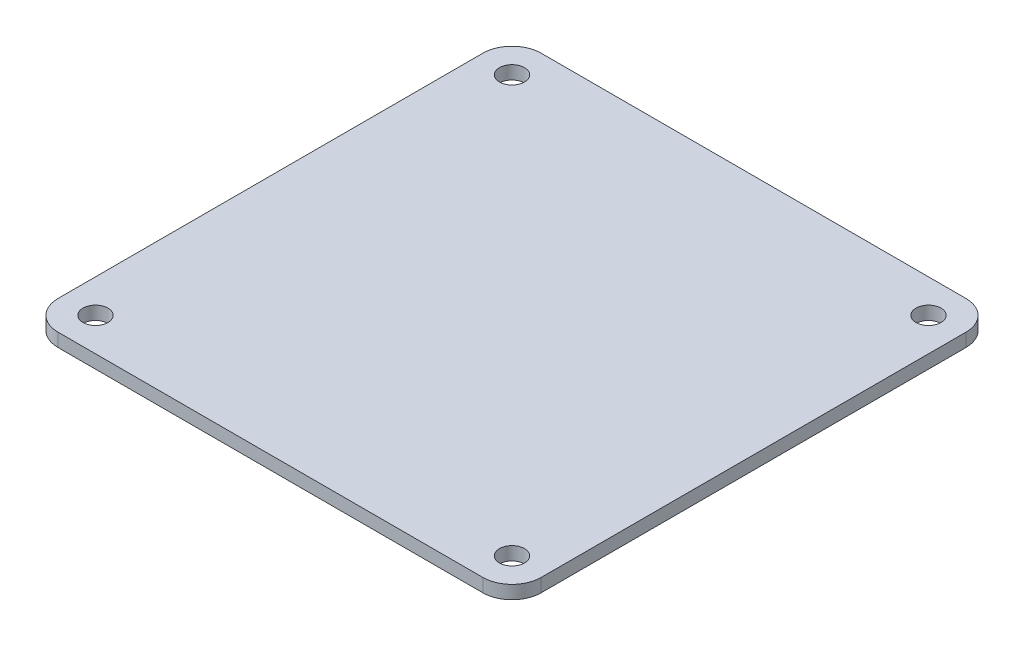
ISO-10303-21;
HEADER;
FILE_DESCRIPTION(('STEP AP214'),'2;1');
FILE_NAME('part.step','',(''),(''),'','','');
FILE_SCHEMA(('AUTOMOTIVE_DESIGN { 1 0 10303 214 1 1 1 1 }'));
ENDSEC;
DATA;
#1=APPLICATION_CONTEXT('core data for automotive mechanical design processes');
#2=APPLICATION_PROTOCOL_DEFINITION('international standard','automotive_design',2000,#1);
#3=PRODUCT_CONTEXT('',#1,'mechanical');
#4=PRODUCT('Part','Part','',(#3));
#5=PRODUCT_RELATED_PRODUCT_CATEGORY('part','',(#4));
#6=PRODUCT_DEFINITION_FORMATION('','',#4);
#7=PRODUCT_DEFINITION_CONTEXT('part definition',#1,'design');
#8=PRODUCT_DEFINITION('design','',#6,#7);
#9=PRODUCT_DEFINITION_SHAPE('','',#8);
#10=(LENGTH_UNIT() NAMED_UNIT(*) SI_UNIT(.MILLI.,.METRE.));
#11=(NAMED_UNIT(*) PLANE_ANGLE_UNIT() SI_UNIT($,.RADIAN.));
#12=(NAMED_UNIT(*) SI_UNIT($,.STERADIAN.) SOLID_ANGLE_UNIT());
#13=UNCERTAINTY_MEASURE_WITH_UNIT(LENGTH_MEASURE(1.E-05),#10,'distance_accuracy_value','');
#14=(GEOMETRIC_REPRESENTATION_CONTEXT(3) GLOBAL_UNCERTAINTY_ASSIGNED_CONTEXT((#13)) GLOBAL_UNIT_ASSIGNED_CONTEXT((#10,
#11,#12)) REPRESENTATION_CONTEXT('',''));
#15=CARTESIAN_POINT('',(0.,0.,0.));
#16=DIRECTION('',(0.,0.,1.));
#17=DIRECTION('',(1.,0.,0.));
#18=AXIS2_PLACEMENT_3D('',#15,#16,#17);
#19=CARTESIAN_POINT('',(0.,1.6,0.));
#20=DIRECTION('',(0.,1.,0.));
#21=DIRECTION('',(0.,0.,1.));
#22=AXIS2_PLACEMENT_3D('',#19,#20,#21);
#23=PLANE('',#22);
#24=CARTESIAN_POINT('',(25.,1.6,25.));
#25=DIRECTION('',(0.,1.,0.));
#26=DIRECTION('',(0.,0.,1.));
#27=AXIS2_PLACEMENT_3D('',#24,#25,#26);
#28=CIRCLE('',#27,1.5);
#29=CARTESIAN_POINT('',(25.,1.6,26.5));
#30=VERTEX_POINT('',#29);
#31=EDGE_CURVE('E186',#30,#30,#28,.T.);
#32=ORIENTED_EDGE('',*,*,#31,.F.);
#33=EDGE_LOOP('',(#32));
#34=FACE_BOUND('',#33,.T.);
#35=CARTESIAN_POINT('',(-25.,1.6,-25.));
#36=DIRECTION('',(0.,1.,0.));
#37=DIRECTION('',(0.,0.,1.));
#38=AXIS2_PLACEMENT_3D('',#35,#36,#37);
#39=CIRCLE('',#38,1.5);
#40=CARTESIAN_POINT('',(-25.,1.6,-23.5));
#41=VERTEX_POINT('',#40);
#42=EDGE_CURVE('E128',#41,#41,#39,.T.);
#43=ORIENTED_EDGE('',*,*,#42,.F.);
#44=EDGE_LOOP('',(#43));
#45=FACE_BOUND('',#44,.T.);
#46=DIRECTION('',(-1.,0.,0.));
#47=VECTOR('',#46,1.);
#48=CARTESIAN_POINT('',(-29.,1.6,-29.));
#49=LINE('',#48,#47);
#50=CARTESIAN_POINT('',(25.5,1.6,-29.));
#51=VERTEX_POINT('',#50);
#52=CARTESIAN_POINT('',(-25.5,1.6,-29.));
#53=VERTEX_POINT('',#52);
#54=EDGE_CURVE('E137',#51,#53,#49,.T.);
#55=ORIENTED_EDGE('',*,*,#54,.T.);
#56=CARTESIAN_POINT('',(-25.5,1.6,-25.5));
#57=DIRECTION('',(0.,1.,0.));
#58=DIRECTION('',(0.,0.,1.));
#59=AXIS2_PLACEMENT_3D('',#56,#57,#58);
#60=CIRCLE('',#59,3.5);
#61=CARTESIAN_POINT('',(-29.,1.6,-25.5));
#62=VERTEX_POINT('',#61);
#63=EDGE_CURVE('E156',#53,#62,#60,.T.);
#64=ORIENTED_EDGE('',*,*,#63,.T.);
#65=DIRECTION('',(0.,0.,1.));
#66=VECTOR('',#65,1.);
#67=CARTESIAN_POINT('',(-29.,1.6,-29.));
#68=LINE('',#67,#66);
#69=CARTESIAN_POINT('',(-29.,1.6,25.5));
#70=VERTEX_POINT('',#69);
#71=EDGE_CURVE('E120',#62,#70,#68,.T.);
#72=ORIENTED_EDGE('',*,*,#71,.T.);
#73=CARTESIAN_POINT('',(-25.5,1.6,25.5));
#74=DIRECTION('',(0.,1.,0.));
#75=DIRECTION('',(0.,0.,1.));
#76=AXIS2_PLACEMENT_3D('',#73,#74,#75);
#77=CIRCLE('',#76,3.5);
#78=CARTESIAN_POINT('',(-25.5,1.6,29.));
#79=VERTEX_POINT('',#78);
#80=EDGE_CURVE('E154',#70,#79,#77,.T.);
#81=ORIENTED_EDGE('',*,*,#80,.T.);
#82=DIRECTION('',(1.,0.,0.));
#83=VECTOR('',#82,1.);
#84=CARTESIAN_POINT('',(-29.,1.6,29.));
#85=LINE('',#84,#83);
#86=CARTESIAN_POINT('',(25.5,1.6,29.));
#87=VERTEX_POINT('',#86);
#88=EDGE_CURVE('E176',#79,#87,#85,.T.);
#89=ORIENTED_EDGE('',*,*,#88,.T.);
#90=CARTESIAN_POINT('',(25.5,1.6,25.5));
#91=DIRECTION('',(0.,1.,0.));
#92=DIRECTION('',(0.,0.,1.));
#93=AXIS2_PLACEMENT_3D('',#90,#91,#92);
#94=CIRCLE('',#93,3.5);
#95=CARTESIAN_POINT('',(29.,1.6,25.5));
#96=VERTEX_POINT('',#95);
#97=EDGE_CURVE('E55',#87,#96,#94,.T.);
#98=ORIENTED_EDGE('',*,*,#97,.T.);
#99=DIRECTION('',(0.,0.,-1.));
#100=VECTOR('',#99,1.);
#101=CARTESIAN_POINT('',(29.,1.6,-29.));
#102=LINE('',#101,#100);
#103=CARTESIAN_POINT('',(29.,1.6,-25.5));
#104=VERTEX_POINT('',#103);
#105=EDGE_CURVE('E166',#96,#104,#102,.T.);
#106=ORIENTED_EDGE('',*,*,#105,.T.);
#107=CARTESIAN_POINT('',(25.5,1.6,-25.5));
#108=DIRECTION('',(0.,1.,0.));
#109=DIRECTION('',(0.,0.,1.));
#110=AXIS2_PLACEMENT_3D('',#107,#108,#109);
#111=CIRCLE('',#110,3.5);
#112=EDGE_CURVE('E152',#104,#51,#111,.T.);
#113=ORIENTED_EDGE('',*,*,#112,.T.);
#114=EDGE_LOOP('',(#55,#64,#72,#81,#89,#98,#106,#113));
#115=FACE_BOUND('',#114,.T.);
#116=CARTESIAN_POINT('',(25.,1.6,-25.));
#117=DIRECTION('',(0.,1.,0.));
#118=DIRECTION('',(0.,0.,-1.));
#119=AXIS2_PLACEMENT_3D('',#116,#117,#118);
#120=CIRCLE('',#119,1.49999999999999);
#121=CARTESIAN_POINT('',(25.,1.6,-26.5));
#122=VERTEX_POINT('',#121);
#123=EDGE_CURVE('E181',#122,#122,#120,.T.);
#124=ORIENTED_EDGE('',*,*,#123,.F.);
#125=EDGE_LOOP('',(#124));
#126=FACE_BOUND('',#125,.T.);
#127=CARTESIAN_POINT('',(-25.,1.6,25.));
#128=DIRECTION('',(0.,1.,0.));
#129=DIRECTION('',(0.,0.,-1.));
#130=AXIS2_PLACEMENT_3D('',#127,#128,#129);
#131=CIRCLE('',#130,1.49999999999999);
#132=CARTESIAN_POINT('',(-25.,1.6,23.5));
#133=VERTEX_POINT('',#132);
#134=EDGE_CURVE('E192',#133,#133,#131,.T.);
#135=ORIENTED_EDGE('',*,*,#134,.F.);
#136=EDGE_LOOP('',(#135));
#137=FACE_BOUND('',#136,.T.);
#138=ADVANCED_FACE('F35',(#34,#45,#115,#126,#137),#23,.T.);
#139=CARTESIAN_POINT('',(0.,0.,0.));
#140=DIRECTION('',(0.,1.,0.));
#141=DIRECTION('',(0.,0.,1.));
#142=AXIS2_PLACEMENT_3D('',#139,#140,#141);
#143=PLANE('',#142);
#144=DIRECTION('',(0.,0.,1.));
#145=VECTOR('',#144,1.);
#146=CARTESIAN_POINT('',(-29.,0.,-29.));
#147=LINE('',#146,#145);
#148=CARTESIAN_POINT('',(-29.,0.,-25.5));
#149=VERTEX_POINT('',#148);
#150=CARTESIAN_POINT('',(-29.,0.,25.5));
#151=VERTEX_POINT('',#150);
#152=EDGE_CURVE('E117',#149,#151,#147,.T.);
#153=ORIENTED_EDGE('',*,*,#152,.F.);
#154=CARTESIAN_POINT('',(-25.5,0.,-25.5));
#155=DIRECTION('',(0.,1.,0.));
#156=DIRECTION('',(0.,0.,1.));
#157=AXIS2_PLACEMENT_3D('',#154,#155,#156);
#158=CIRCLE('',#157,3.5);
#159=CARTESIAN_POINT('',(-25.5,0.,-29.));
#160=VERTEX_POINT('',#159);
#161=EDGE_CURVE('E100',#149,#160,#158,.F.);
#162=ORIENTED_EDGE('',*,*,#161,.T.);
#163=DIRECTION('',(-1.,0.,0.));
#164=VECTOR('',#163,1.);
#165=CARTESIAN_POINT('',(-29.,0.,-29.));
#166=LINE('',#165,#164);
#167=CARTESIAN_POINT('',(25.5,0.,-29.));
#168=VERTEX_POINT('',#167);
#169=EDGE_CURVE('E141',#168,#160,#166,.T.);
#170=ORIENTED_EDGE('',*,*,#169,.F.);
#171=CARTESIAN_POINT('',(25.5,0.,-25.5));
#172=DIRECTION('',(0.,1.,0.));
#173=DIRECTION('',(0.,0.,1.));
#174=AXIS2_PLACEMENT_3D('',#171,#172,#173);
#175=CIRCLE('',#174,3.5);
#176=CARTESIAN_POINT('',(29.,0.,-25.5));
#177=VERTEX_POINT('',#176);
#178=EDGE_CURVE('E145',#168,#177,#175,.F.);
#179=ORIENTED_EDGE('',*,*,#178,.T.);
#180=DIRECTION('',(0.,0.,-1.));
#181=VECTOR('',#180,1.);
#182=CARTESIAN_POINT('',(29.,0.,-29.));
#183=LINE('',#182,#181);
#184=CARTESIAN_POINT('',(29.,0.,25.5));
#185=VERTEX_POINT('',#184);
#186=EDGE_CURVE('E131',#185,#177,#183,.T.);
#187=ORIENTED_EDGE('',*,*,#186,.F.);
#188=CARTESIAN_POINT('',(25.5,0.,25.5));
#189=DIRECTION('',(0.,1.,0.));
#190=DIRECTION('',(0.,0.,1.));
#191=AXIS2_PLACEMENT_3D('',#188,#189,#190);
#192=CIRCLE('',#191,3.5);
#193=CARTESIAN_POINT('',(25.5,0.,29.));
#194=VERTEX_POINT('',#193);
#195=EDGE_CURVE('E121',#185,#194,#192,.F.);
#196=ORIENTED_EDGE('',*,*,#195,.T.);
#197=DIRECTION('',(1.,0.,0.));
#198=VECTOR('',#197,1.);
#199=CARTESIAN_POINT('',(-29.,0.,29.));
#200=LINE('',#199,#198);
#201=CARTESIAN_POINT('',(-25.5,0.,29.));
#202=VERTEX_POINT('',#201);
#203=EDGE_CURVE('E127',#202,#194,#200,.T.);
#204=ORIENTED_EDGE('',*,*,#203,.F.);
#205=CARTESIAN_POINT('',(-25.5,0.,25.5));
#206=DIRECTION('',(0.,1.,0.));
#207=DIRECTION('',(0.,0.,1.));
#208=AXIS2_PLACEMENT_3D('',#205,#206,#207);
#209=CIRCLE('',#208,3.5);
#210=EDGE_CURVE('E111',#202,#151,#209,.F.);
#211=ORIENTED_EDGE('',*,*,#210,.T.);
#212=EDGE_LOOP('',(#153,#162,#170,#179,#187,#196,#204,#211));
#213=FACE_BOUND('',#212,.T.);
#214=CARTESIAN_POINT('',(-25.,0.,-25.));
#215=DIRECTION('',(0.,1.,0.));
#216=DIRECTION('',(0.,0.,1.));
#217=AXIS2_PLACEMENT_3D('',#214,#215,#216);
#218=CIRCLE('',#217,1.5);
#219=CARTESIAN_POINT('',(-25.,0.,-23.5));
#220=VERTEX_POINT('',#219);
#221=EDGE_CURVE('E134',#220,#220,#218,.T.);
#222=ORIENTED_EDGE('',*,*,#221,.T.);
#223=EDGE_LOOP('',(#222));
#224=FACE_BOUND('',#223,.T.);
#225=CARTESIAN_POINT('',(25.,0.,-25.));
#226=DIRECTION('',(0.,1.,0.));
#227=DIRECTION('',(0.,0.,-1.));
#228=AXIS2_PLACEMENT_3D('',#225,#226,#227);
#229=CIRCLE('',#228,1.49999999999999);
#230=CARTESIAN_POINT('',(25.,0.,-26.5));
#231=VERTEX_POINT('',#230);
#232=EDGE_CURVE('E183',#231,#231,#229,.T.);
#233=ORIENTED_EDGE('',*,*,#232,.T.);
#234=EDGE_LOOP('',(#233));
#235=FACE_BOUND('',#234,.T.);
#236=CARTESIAN_POINT('',(25.,0.,25.));
#237=DIRECTION('',(0.,1.,0.));
#238=DIRECTION('',(0.,0.,1.));
#239=AXIS2_PLACEMENT_3D('',#236,#237,#238);
#240=CIRCLE('',#239,1.5);
#241=CARTESIAN_POINT('',(25.,0.,26.5));
#242=VERTEX_POINT('',#241);
#243=EDGE_CURVE('E189',#242,#242,#240,.T.);
#244=ORIENTED_EDGE('',*,*,#243,.T.);
#245=EDGE_LOOP('',(#244));
#246=FACE_BOUND('',#245,.T.);
#247=CARTESIAN_POINT('',(-25.,0.,25.));
#248=DIRECTION('',(0.,1.,0.));
#249=DIRECTION('',(0.,0.,-1.));
#250=AXIS2_PLACEMENT_3D('',#247,#248,#249);
#251=CIRCLE('',#250,1.49999999999999);
#252=CARTESIAN_POINT('',(-25.,0.,23.5));
#253=VERTEX_POINT('',#252);
#254=EDGE_CURVE('E195',#253,#253,#251,.T.);
#255=ORIENTED_EDGE('',*,*,#254,.T.);
#256=EDGE_LOOP('',(#255));
#257=FACE_BOUND('',#256,.T.);
#258=ADVANCED_FACE('F124',(#213,#224,#235,#246,#257),#143,.F.);
#259=CARTESIAN_POINT('',(-29.,1.6,-29.));
#260=DIRECTION('',(1.,0.,0.));
#261=DIRECTION('',(0.,0.,-1.));
#262=AXIS2_PLACEMENT_3D('',#259,#260,#261);
#263=PLANE('',#262);
#264=ORIENTED_EDGE('',*,*,#71,.F.);
#265=DIRECTION('',(0.,-1.,0.));
#266=VECTOR('',#265,1.);
#267=CARTESIAN_POINT('',(-29.,1.6,-25.5));
#268=LINE('',#267,#266);
#269=EDGE_CURVE('E104',#62,#149,#268,.T.);
#270=ORIENTED_EDGE('',*,*,#269,.T.);
#271=ORIENTED_EDGE('',*,*,#152,.T.);
#272=DIRECTION('',(0.,-1.,0.));
#273=VECTOR('',#272,1.);
#274=CARTESIAN_POINT('',(-29.,1.6,25.5));
#275=LINE('',#274,#273);
#276=EDGE_CURVE('E122',#151,#70,#275,.F.);
#277=ORIENTED_EDGE('',*,*,#276,.T.);
#278=EDGE_LOOP('',(#264,#270,#271,#277));
#279=FACE_BOUND('',#278,.T.);
#280=ADVANCED_FACE('F116',(#279),#263,.F.);
#281=CARTESIAN_POINT('',(-29.,1.6,29.));
#282=DIRECTION('',(0.,0.,-1.));
#283=DIRECTION('',(-1.,0.,0.));
#284=AXIS2_PLACEMENT_3D('',#281,#282,#283);
#285=PLANE('',#284);
#286=ORIENTED_EDGE('',*,*,#88,.F.);
#287=DIRECTION('',(0.,-1.,0.));
#288=VECTOR('',#287,1.);
#289=CARTESIAN_POINT('',(-25.5,1.6,29.));
#290=LINE('',#289,#288);
#291=EDGE_CURVE('E160',#79,#202,#290,.T.);
#292=ORIENTED_EDGE('',*,*,#291,.T.);
#293=ORIENTED_EDGE('',*,*,#203,.T.);
#294=DIRECTION('',(0.,-1.,0.));
#295=VECTOR('',#294,1.);
#296=CARTESIAN_POINT('',(25.5,1.6,29.));
#297=LINE('',#296,#295);
#298=EDGE_CURVE('E158',#194,#87,#297,.F.);
#299=ORIENTED_EDGE('',*,*,#298,.T.);
#300=EDGE_LOOP('',(#286,#292,#293,#299));
#301=FACE_BOUND('',#300,.T.);
#302=ADVANCED_FACE('F221',(#301),#285,.F.);
#303=CARTESIAN_POINT('',(29.,1.6,-29.));
#304=DIRECTION('',(-1.,0.,0.));
#305=DIRECTION('',(0.,0.,1.));
#306=AXIS2_PLACEMENT_3D('',#303,#304,#305);
#307=PLANE('',#306);
#308=ORIENTED_EDGE('',*,*,#186,.T.);
#309=DIRECTION('',(0.,-1.,0.));
#310=VECTOR('',#309,1.);
#311=CARTESIAN_POINT('',(29.,1.6,-25.5));
#312=LINE('',#311,#310);
#313=EDGE_CURVE('E11',#177,#104,#312,.F.);
#314=ORIENTED_EDGE('',*,*,#313,.T.);
#315=ORIENTED_EDGE('',*,*,#105,.F.);
#316=DIRECTION('',(0.,-1.,0.));
#317=VECTOR('',#316,1.);
#318=CARTESIAN_POINT('',(29.,1.6,25.5));
#319=LINE('',#318,#317);
#320=EDGE_CURVE('E43',#96,#185,#319,.T.);
#321=ORIENTED_EDGE('',*,*,#320,.T.);
#322=EDGE_LOOP('',(#308,#314,#315,#321));
#323=FACE_BOUND('',#322,.T.);
#324=ADVANCED_FACE('F165',(#323),#307,.F.);
#325=CARTESIAN_POINT('',(-29.,1.6,-29.));
#326=DIRECTION('',(0.,0.,1.));
#327=DIRECTION('',(1.,0.,0.));
#328=AXIS2_PLACEMENT_3D('',#325,#326,#327);
#329=PLANE('',#328);
#330=ORIENTED_EDGE('',*,*,#169,.T.);
#331=DIRECTION('',(0.,-1.,0.));
#332=VECTOR('',#331,1.);
#333=CARTESIAN_POINT('',(-25.5,1.6,-29.));
#334=LINE('',#333,#332);
#335=EDGE_CURVE('E105',#160,#53,#334,.F.);
#336=ORIENTED_EDGE('',*,*,#335,.T.);
#337=ORIENTED_EDGE('',*,*,#54,.F.);
#338=DIRECTION('',(0.,-1.,0.));
#339=VECTOR('',#338,1.);
#340=CARTESIAN_POINT('',(25.5,1.6,-29.));
#341=LINE('',#340,#339);
#342=EDGE_CURVE('E110',#51,#168,#341,.T.);
#343=ORIENTED_EDGE('',*,*,#342,.T.);
#344=EDGE_LOOP('',(#330,#336,#337,#343));
#345=FACE_BOUND('',#344,.T.);
#346=ADVANCED_FACE('F174',(#345),#329,.F.);
#347=CARTESIAN_POINT('',(-25.,1.6,-25.));
#348=DIRECTION('',(0.,-1.,0.));
#349=DIRECTION('',(0.,0.,-1.));
#350=AXIS2_PLACEMENT_3D('',#347,#348,#349);
#351=CYLINDRICAL_SURFACE('',#350,1.5);
#352=ORIENTED_EDGE('',*,*,#42,.T.);
#353=EDGE_LOOP('',(#352));
#354=FACE_BOUND('',#353,.T.);
#355=ORIENTED_EDGE('',*,*,#221,.F.);
#356=EDGE_LOOP('',(#355));
#357=FACE_BOUND('',#356,.T.);
#358=ADVANCED_FACE('F214',(#354,#357),#351,.F.);
#359=CARTESIAN_POINT('',(25.,1.6,-25.));
#360=DIRECTION('',(0.,-1.,0.));
#361=DIRECTION('',(0.,0.,-1.));
#362=AXIS2_PLACEMENT_3D('',#359,#360,#361);
#363=CYLINDRICAL_SURFACE('',#362,1.49999999999999);
#364=ORIENTED_EDGE('',*,*,#123,.T.);
#365=EDGE_LOOP('',(#364));
#366=FACE_BOUND('',#365,.T.);
#367=ORIENTED_EDGE('',*,*,#232,.F.);
#368=EDGE_LOOP('',(#367));
#369=FACE_BOUND('',#368,.T.);
#370=ADVANCED_FACE('F245',(#366,#369),#363,.F.);
#371=CARTESIAN_POINT('',(25.,1.6,25.));
#372=DIRECTION('',(0.,-1.,0.));
#373=DIRECTION('',(0.,0.,-1.));
#374=AXIS2_PLACEMENT_3D('',#371,#372,#373);
#375=CYLINDRICAL_SURFACE('',#374,1.5);
#376=ORIENTED_EDGE('',*,*,#31,.T.);
#377=EDGE_LOOP('',(#376));
#378=FACE_BOUND('',#377,.T.);
#379=ORIENTED_EDGE('',*,*,#243,.F.);
#380=EDGE_LOOP('',(#379));
#381=FACE_BOUND('',#380,.T.);
#382=ADVANCED_FACE('F248',(#378,#381),#375,.F.);
#383=CARTESIAN_POINT('',(-25.,1.6,25.));
#384=DIRECTION('',(0.,-1.,0.));
#385=DIRECTION('',(0.,0.,-1.));
#386=AXIS2_PLACEMENT_3D('',#383,#384,#385);
#387=CYLINDRICAL_SURFACE('',#386,1.49999999999999);
#388=ORIENTED_EDGE('',*,*,#134,.T.);
#389=EDGE_LOOP('',(#388));
#390=FACE_BOUND('',#389,.T.);
#391=ORIENTED_EDGE('',*,*,#254,.F.);
#392=EDGE_LOOP('',(#391));
#393=FACE_BOUND('',#392,.T.);
#394=ADVANCED_FACE('F201',(#390,#393),#387,.F.);
#395=CARTESIAN_POINT('',(-25.5,1.6,-25.5));
#396=DIRECTION('',(0.,-1.,0.));
#397=DIRECTION('',(0.,0.,-1.));
#398=AXIS2_PLACEMENT_3D('',#395,#396,#397);
#399=CYLINDRICAL_SURFACE('',#398,3.5);
#400=ORIENTED_EDGE('',*,*,#63,.F.);
#401=ORIENTED_EDGE('',*,*,#335,.F.);
#402=ORIENTED_EDGE('',*,*,#161,.F.);
#403=ORIENTED_EDGE('',*,*,#269,.F.);
#404=EDGE_LOOP('',(#400,#401,#402,#403));
#405=FACE_BOUND('',#404,.T.);
#406=ADVANCED_FACE('F103',(#405),#399,.T.);
#407=CARTESIAN_POINT('',(-25.5,1.6,25.5));
#408=DIRECTION('',(0.,-1.,0.));
#409=DIRECTION('',(0.,0.,-1.));
#410=AXIS2_PLACEMENT_3D('',#407,#408,#409);
#411=CYLINDRICAL_SURFACE('',#410,3.5);
#412=ORIENTED_EDGE('',*,*,#80,.F.);
#413=ORIENTED_EDGE('',*,*,#276,.F.);
#414=ORIENTED_EDGE('',*,*,#210,.F.);
#415=ORIENTED_EDGE('',*,*,#291,.F.);
#416=EDGE_LOOP('',(#412,#413,#414,#415));
#417=FACE_BOUND('',#416,.T.);
#418=ADVANCED_FACE('F229',(#417),#411,.T.);
#419=CARTESIAN_POINT('',(25.5,1.6,-25.5));
#420=DIRECTION('',(0.,-1.,0.));
#421=DIRECTION('',(0.,0.,-1.));
#422=AXIS2_PLACEMENT_3D('',#419,#420,#421);
#423=CYLINDRICAL_SURFACE('',#422,3.5);
#424=ORIENTED_EDGE('',*,*,#112,.F.);
#425=ORIENTED_EDGE('',*,*,#313,.F.);
#426=ORIENTED_EDGE('',*,*,#178,.F.);
#427=ORIENTED_EDGE('',*,*,#342,.F.);
#428=EDGE_LOOP('',(#424,#425,#426,#427));
#429=FACE_BOUND('',#428,.T.);
#430=ADVANCED_FACE('F171',(#429),#423,.T.);
#431=CARTESIAN_POINT('',(25.5,1.6,25.5));
#432=DIRECTION('',(0.,-1.,0.));
#433=DIRECTION('',(0.,0.,-1.));
#434=AXIS2_PLACEMENT_3D('',#431,#432,#433);
#435=CYLINDRICAL_SURFACE('',#434,3.5);
#436=ORIENTED_EDGE('',*,*,#97,.F.);
#437=ORIENTED_EDGE('',*,*,#298,.F.);
#438=ORIENTED_EDGE('',*,*,#195,.F.);
#439=ORIENTED_EDGE('',*,*,#320,.F.);
#440=EDGE_LOOP('',(#436,#437,#438,#439));
#441=FACE_BOUND('',#440,.T.);
#442=ADVANCED_FACE('F37',(#441),#435,.T.);
#443=CLOSED_SHELL('',(#138,#258,#280,#302,#324,#346,#358,#370,#382,#394,#406,#418,#430,#442));
#444=MANIFOLD_SOLID_BREP('B2',#443);
#445=ADVANCED_BREP_SHAPE_REPRESENTATION('',(#18,#444),#14);
#446=SHAPE_DEFINITION_REPRESENTATION(#9,#445);
ENDSEC;
END-ISO-10303-21;
